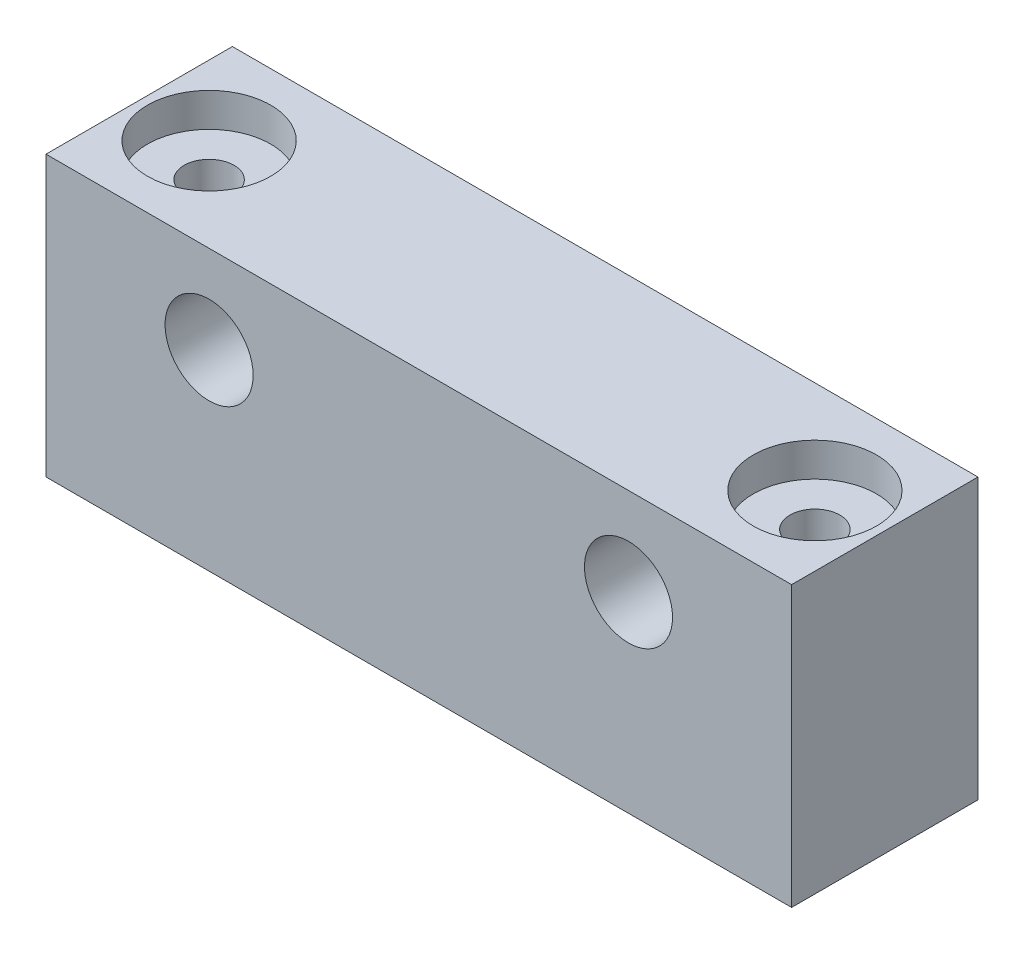
ISO-10303-21;
HEADER;
FILE_DESCRIPTION(('STEP AP214'),'2;1');
FILE_NAME('part.step','',(''),(''),'','','');
FILE_SCHEMA(('AUTOMOTIVE_DESIGN { 1 0 10303 214 1 1 1 1 }'));
ENDSEC;
DATA;
#1=APPLICATION_CONTEXT('core data for automotive mechanical design processes');
#2=APPLICATION_PROTOCOL_DEFINITION('international standard','automotive_design',2000,#1);
#3=PRODUCT_CONTEXT('',#1,'mechanical');
#4=PRODUCT('Part','Part','',(#3));
#5=PRODUCT_RELATED_PRODUCT_CATEGORY('part','',(#4));
#6=PRODUCT_DEFINITION_FORMATION('','',#4);
#7=PRODUCT_DEFINITION_CONTEXT('part definition',#1,'design');
#8=PRODUCT_DEFINITION('design','',#6,#7);
#9=PRODUCT_DEFINITION_SHAPE('','',#8);
#10=(LENGTH_UNIT() NAMED_UNIT(*) SI_UNIT(.MILLI.,.METRE.));
#11=(NAMED_UNIT(*) PLANE_ANGLE_UNIT() SI_UNIT($,.RADIAN.));
#12=(NAMED_UNIT(*) SI_UNIT($,.STERADIAN.) SOLID_ANGLE_UNIT());
#13=UNCERTAINTY_MEASURE_WITH_UNIT(LENGTH_MEASURE(1.E-05),#10,'distance_accuracy_value','');
#14=(GEOMETRIC_REPRESENTATION_CONTEXT(3) GLOBAL_UNCERTAINTY_ASSIGNED_CONTEXT((#13)) GLOBAL_UNIT_ASSIGNED_CONTEXT((#10,
#11,#12)) REPRESENTATION_CONTEXT('',''));
#15=CARTESIAN_POINT('',(0.,0.,0.));
#16=DIRECTION('',(0.,0.,1.));
#17=DIRECTION('',(1.,0.,0.));
#18=AXIS2_PLACEMENT_3D('',#15,#16,#17);
#19=CARTESIAN_POINT('',(0.,0.,12.7));
#20=DIRECTION('',(0.,0.,-1.));
#21=DIRECTION('',(-1.,0.,0.));
#22=AXIS2_PLACEMENT_3D('',#19,#20,#21);
#23=PLANE('',#22);
#24=DIRECTION('',(0.,1.,0.));
#25=VECTOR('',#24,1.);
#26=CARTESIAN_POINT('',(25.4,-9.525,12.7));
#27=LINE('',#26,#25);
#28=CARTESIAN_POINT('',(25.4,-9.525,12.7));
#29=VERTEX_POINT('',#28);
#30=CARTESIAN_POINT('',(25.4,9.525,12.7));
#31=VERTEX_POINT('',#30);
#32=EDGE_CURVE('E86',#29,#31,#27,.T.);
#33=ORIENTED_EDGE('',*,*,#32,.T.);
#34=DIRECTION('',(-1.,0.,0.));
#35=VECTOR('',#34,1.);
#36=CARTESIAN_POINT('',(-25.4,9.525,12.7));
#37=LINE('',#36,#35);
#38=CARTESIAN_POINT('',(-25.4,9.525,12.7));
#39=VERTEX_POINT('',#38);
#40=EDGE_CURVE('E81',#31,#39,#37,.T.);
#41=ORIENTED_EDGE('',*,*,#40,.T.);
#42=DIRECTION('',(0.,-1.,0.));
#43=VECTOR('',#42,1.);
#44=CARTESIAN_POINT('',(-25.4,-9.525,12.7));
#45=LINE('',#44,#43);
#46=CARTESIAN_POINT('',(-25.4,-9.525,12.7));
#47=VERTEX_POINT('',#46);
#48=EDGE_CURVE('E84',#39,#47,#45,.T.);
#49=ORIENTED_EDGE('',*,*,#48,.T.);
#50=DIRECTION('',(1.,0.,0.));
#51=VECTOR('',#50,1.);
#52=CARTESIAN_POINT('',(-25.4,-9.525,12.7));
#53=LINE('',#52,#51);
#54=EDGE_CURVE('E51',#47,#29,#53,.T.);
#55=ORIENTED_EDGE('',*,*,#54,.T.);
#56=EDGE_LOOP('',(#33,#41,#49,#55));
#57=FACE_BOUND('',#56,.T.);
#58=CARTESIAN_POINT('',(-14.2875,3.525,12.7));
#59=DIRECTION('',(0.,0.,1.));
#60=DIRECTION('',(1.,0.,0.));
#61=AXIS2_PLACEMENT_3D('',#58,#59,#60);
#62=CIRCLE('',#61,3.);
#63=CARTESIAN_POINT('',(-11.2875,3.525,12.7));
#64=VERTEX_POINT('',#63);
#65=EDGE_CURVE('E101',#64,#64,#62,.T.);
#66=ORIENTED_EDGE('',*,*,#65,.F.);
#67=EDGE_LOOP('',(#66));
#68=FACE_BOUND('',#67,.T.);
#69=CARTESIAN_POINT('',(14.2875,3.525,12.7));
#70=DIRECTION('',(0.,0.,1.));
#71=DIRECTION('',(1.,0.,0.));
#72=AXIS2_PLACEMENT_3D('',#69,#70,#71);
#73=CIRCLE('',#72,3.);
#74=CARTESIAN_POINT('',(17.2875,3.525,12.7));
#75=VERTEX_POINT('',#74);
#76=EDGE_CURVE('E116',#75,#75,#73,.T.);
#77=ORIENTED_EDGE('',*,*,#76,.F.);
#78=EDGE_LOOP('',(#77));
#79=FACE_BOUND('',#78,.T.);
#80=ADVANCED_FACE('F34',(#57,#68,#79),#23,.F.);
#81=CARTESIAN_POINT('',(0.,0.,0.));
#82=DIRECTION('',(0.,0.,-1.));
#83=DIRECTION('',(-1.,0.,0.));
#84=AXIS2_PLACEMENT_3D('',#81,#82,#83);
#85=PLANE('',#84);
#86=CARTESIAN_POINT('',(-14.2875,3.525,0.));
#87=DIRECTION('',(0.,0.,1.));
#88=DIRECTION('',(1.,0.,0.));
#89=AXIS2_PLACEMENT_3D('',#86,#87,#88);
#90=CIRCLE('',#89,3.);
#91=CARTESIAN_POINT('',(-11.2875,3.525,0.));
#92=VERTEX_POINT('',#91);
#93=EDGE_CURVE('E113',#92,#92,#90,.T.);
#94=ORIENTED_EDGE('',*,*,#93,.T.);
#95=EDGE_LOOP('',(#94));
#96=FACE_BOUND('',#95,.T.);
#97=DIRECTION('',(0.,1.,0.));
#98=VECTOR('',#97,1.);
#99=CARTESIAN_POINT('',(25.4,-9.525,0.));
#100=LINE('',#99,#98);
#101=CARTESIAN_POINT('',(25.4,-9.525,0.));
#102=VERTEX_POINT('',#101);
#103=CARTESIAN_POINT('',(25.4,9.525,0.));
#104=VERTEX_POINT('',#103);
#105=EDGE_CURVE('E98',#102,#104,#100,.T.);
#106=ORIENTED_EDGE('',*,*,#105,.F.);
#107=DIRECTION('',(1.,0.,0.));
#108=VECTOR('',#107,1.);
#109=CARTESIAN_POINT('',(-25.4,-9.525,0.));
#110=LINE('',#109,#108);
#111=CARTESIAN_POINT('',(-25.4,-9.525,0.));
#112=VERTEX_POINT('',#111);
#113=EDGE_CURVE('E74',#112,#102,#110,.T.);
#114=ORIENTED_EDGE('',*,*,#113,.F.);
#115=DIRECTION('',(0.,-1.,0.));
#116=VECTOR('',#115,1.);
#117=CARTESIAN_POINT('',(-25.4,-9.525,0.));
#118=LINE('',#117,#116);
#119=CARTESIAN_POINT('',(-25.4,9.525,0.));
#120=VERTEX_POINT('',#119);
#121=EDGE_CURVE('E68',#120,#112,#118,.T.);
#122=ORIENTED_EDGE('',*,*,#121,.F.);
#123=DIRECTION('',(-1.,0.,0.));
#124=VECTOR('',#123,1.);
#125=CARTESIAN_POINT('',(-25.4,9.525,0.));
#126=LINE('',#125,#124);
#127=EDGE_CURVE('E90',#104,#120,#126,.T.);
#128=ORIENTED_EDGE('',*,*,#127,.F.);
#129=EDGE_LOOP('',(#106,#114,#122,#128));
#130=FACE_BOUND('',#129,.T.);
#131=CARTESIAN_POINT('',(14.2875,3.525,0.));
#132=DIRECTION('',(0.,0.,1.));
#133=DIRECTION('',(1.,0.,0.));
#134=AXIS2_PLACEMENT_3D('',#131,#132,#133);
#135=CIRCLE('',#134,3.);
#136=CARTESIAN_POINT('',(17.2875,3.525,0.));
#137=VERTEX_POINT('',#136);
#138=EDGE_CURVE('E119',#137,#137,#135,.T.);
#139=ORIENTED_EDGE('',*,*,#138,.T.);
#140=EDGE_LOOP('',(#139));
#141=FACE_BOUND('',#140,.T.);
#142=ADVANCED_FACE('F109',(#96,#130,#141),#85,.T.);
#143=CARTESIAN_POINT('',(25.4,-9.525,12.7));
#144=DIRECTION('',(-1.,0.,0.));
#145=DIRECTION('',(0.,0.,1.));
#146=AXIS2_PLACEMENT_3D('',#143,#144,#145);
#147=PLANE('',#146);
#148=ORIENTED_EDGE('',*,*,#105,.T.);
#149=DIRECTION('',(0.,0.,-1.));
#150=VECTOR('',#149,1.);
#151=CARTESIAN_POINT('',(25.4,9.525,12.7));
#152=LINE('',#151,#150);
#153=EDGE_CURVE('E11',#31,#104,#152,.T.);
#154=ORIENTED_EDGE('',*,*,#153,.F.);
#155=ORIENTED_EDGE('',*,*,#32,.F.);
#156=DIRECTION('',(0.,0.,-1.));
#157=VECTOR('',#156,1.);
#158=CARTESIAN_POINT('',(25.4,-9.525,12.7));
#159=LINE('',#158,#157);
#160=EDGE_CURVE('E94',#29,#102,#159,.T.);
#161=ORIENTED_EDGE('',*,*,#160,.T.);
#162=EDGE_LOOP('',(#148,#154,#155,#161));
#163=FACE_BOUND('',#162,.T.);
#164=ADVANCED_FACE('F36',(#163),#147,.F.);
#165=CARTESIAN_POINT('',(-25.4,9.525,12.7));
#166=DIRECTION('',(0.,-1.,0.));
#167=DIRECTION('',(0.,0.,-1.));
#168=AXIS2_PLACEMENT_3D('',#165,#166,#167);
#169=PLANE('',#168);
#170=CARTESIAN_POINT('',(-20.6375,9.525,6.35));
#171=DIRECTION('',(0.,1.,0.));
#172=DIRECTION('',(0.,0.,1.));
#173=AXIS2_PLACEMENT_3D('',#170,#171,#172);
#174=CIRCLE('',#173,4.2);
#175=CARTESIAN_POINT('',(-20.6375,9.525,10.55));
#176=VERTEX_POINT('',#175);
#177=EDGE_CURVE('E145',#176,#176,#174,.T.);
#178=ORIENTED_EDGE('',*,*,#177,.F.);
#179=EDGE_LOOP('',(#178));
#180=FACE_BOUND('',#179,.T.);
#181=CARTESIAN_POINT('',(20.6375,9.525,6.35));
#182=DIRECTION('',(0.,1.,0.));
#183=DIRECTION('',(0.,0.,1.));
#184=AXIS2_PLACEMENT_3D('',#181,#182,#183);
#185=CIRCLE('',#184,4.2);
#186=CARTESIAN_POINT('',(20.6375,9.525,10.55));
#187=VERTEX_POINT('',#186);
#188=EDGE_CURVE('E133',#187,#187,#185,.T.);
#189=ORIENTED_EDGE('',*,*,#188,.F.);
#190=EDGE_LOOP('',(#189));
#191=FACE_BOUND('',#190,.T.);
#192=ORIENTED_EDGE('',*,*,#127,.T.);
#193=DIRECTION('',(0.,0.,-1.));
#194=VECTOR('',#193,1.);
#195=CARTESIAN_POINT('',(-25.4,9.525,12.7));
#196=LINE('',#195,#194);
#197=EDGE_CURVE('E43',#39,#120,#196,.T.);
#198=ORIENTED_EDGE('',*,*,#197,.F.);
#199=ORIENTED_EDGE('',*,*,#40,.F.);
#200=ORIENTED_EDGE('',*,*,#153,.T.);
#201=EDGE_LOOP('',(#192,#198,#199,#200));
#202=FACE_BOUND('',#201,.T.);
#203=ADVANCED_FACE('F89',(#180,#191,#202),#169,.F.);
#204=CARTESIAN_POINT('',(-25.4,-9.525,12.7));
#205=DIRECTION('',(1.,0.,0.));
#206=DIRECTION('',(0.,0.,-1.));
#207=AXIS2_PLACEMENT_3D('',#204,#205,#206);
#208=PLANE('',#207);
#209=ORIENTED_EDGE('',*,*,#121,.T.);
#210=DIRECTION('',(0.,0.,-1.));
#211=VECTOR('',#210,1.);
#212=CARTESIAN_POINT('',(-25.4,-9.525,12.7));
#213=LINE('',#212,#211);
#214=EDGE_CURVE('E91',#47,#112,#213,.T.);
#215=ORIENTED_EDGE('',*,*,#214,.F.);
#216=ORIENTED_EDGE('',*,*,#48,.F.);
#217=ORIENTED_EDGE('',*,*,#197,.T.);
#218=EDGE_LOOP('',(#209,#215,#216,#217));
#219=FACE_BOUND('',#218,.T.);
#220=ADVANCED_FACE('F92',(#219),#208,.F.);
#221=CARTESIAN_POINT('',(-25.4,-9.525,12.7));
#222=DIRECTION('',(0.,1.,0.));
#223=DIRECTION('',(0.,0.,1.));
#224=AXIS2_PLACEMENT_3D('',#221,#222,#223);
#225=PLANE('',#224);
#226=CARTESIAN_POINT('',(-20.6375,-9.525,6.35));
#227=DIRECTION('',(0.,1.,0.));
#228=DIRECTION('',(0.,0.,1.));
#229=AXIS2_PLACEMENT_3D('',#226,#227,#228);
#230=CIRCLE('',#229,1.7);
#231=CARTESIAN_POINT('',(-20.6375,-9.525,8.05));
#232=VERTEX_POINT('',#231);
#233=EDGE_CURVE('E136',#232,#232,#230,.T.);
#234=ORIENTED_EDGE('',*,*,#233,.T.);
#235=EDGE_LOOP('',(#234));
#236=FACE_BOUND('',#235,.T.);
#237=CARTESIAN_POINT('',(20.6375,-9.525,6.35));
#238=DIRECTION('',(0.,1.,0.));
#239=DIRECTION('',(0.,0.,1.));
#240=AXIS2_PLACEMENT_3D('',#237,#238,#239);
#241=CIRCLE('',#240,1.7);
#242=CARTESIAN_POINT('',(20.6375,-9.525,8.05));
#243=VERTEX_POINT('',#242);
#244=EDGE_CURVE('E122',#243,#243,#241,.T.);
#245=ORIENTED_EDGE('',*,*,#244,.T.);
#246=EDGE_LOOP('',(#245));
#247=FACE_BOUND('',#246,.T.);
#248=ORIENTED_EDGE('',*,*,#113,.T.);
#249=ORIENTED_EDGE('',*,*,#160,.F.);
#250=ORIENTED_EDGE('',*,*,#54,.F.);
#251=ORIENTED_EDGE('',*,*,#214,.T.);
#252=EDGE_LOOP('',(#248,#249,#250,#251));
#253=FACE_BOUND('',#252,.T.);
#254=ADVANCED_FACE('F106',(#236,#247,#253),#225,.F.);
#255=CARTESIAN_POINT('',(-14.2875,3.525,12.7));
#256=DIRECTION('',(0.,0.,-1.));
#257=DIRECTION('',(-1.,0.,0.));
#258=AXIS2_PLACEMENT_3D('',#255,#256,#257);
#259=CYLINDRICAL_SURFACE('',#258,3.);
#260=ORIENTED_EDGE('',*,*,#65,.T.);
#261=EDGE_LOOP('',(#260));
#262=FACE_BOUND('',#261,.T.);
#263=ORIENTED_EDGE('',*,*,#93,.F.);
#264=EDGE_LOOP('',(#263));
#265=FACE_BOUND('',#264,.T.);
#266=ADVANCED_FACE('F180',(#262,#265),#259,.F.);
#267=CARTESIAN_POINT('',(14.2875,3.525,12.7));
#268=DIRECTION('',(0.,0.,-1.));
#269=DIRECTION('',(-1.,0.,0.));
#270=AXIS2_PLACEMENT_3D('',#267,#268,#269);
#271=CYLINDRICAL_SURFACE('',#270,3.);
#272=ORIENTED_EDGE('',*,*,#76,.T.);
#273=EDGE_LOOP('',(#272));
#274=FACE_BOUND('',#273,.T.);
#275=ORIENTED_EDGE('',*,*,#138,.F.);
#276=EDGE_LOOP('',(#275));
#277=FACE_BOUND('',#276,.T.);
#278=ADVANCED_FACE('F204',(#274,#277),#271,.F.);
#279=CARTESIAN_POINT('',(20.6375,9.525,6.35));
#280=DIRECTION('',(0.,1.,0.));
#281=DIRECTION('',(0.,0.,1.));
#282=AXIS2_PLACEMENT_3D('',#279,#280,#281);
#283=CYLINDRICAL_SURFACE('',#282,1.7);
#284=ORIENTED_EDGE('',*,*,#244,.F.);
#285=EDGE_LOOP('',(#284));
#286=FACE_BOUND('',#285,.T.);
#287=CARTESIAN_POINT('',(20.6375,7.225,6.35));
#288=DIRECTION('',(0.,1.,0.));
#289=DIRECTION('',(0.,0.,1.));
#290=AXIS2_PLACEMENT_3D('',#287,#288,#289);
#291=CIRCLE('',#290,1.7);
#292=CARTESIAN_POINT('',(20.6375,7.225,8.05));
#293=VERTEX_POINT('',#292);
#294=EDGE_CURVE('E127',#293,#293,#291,.T.);
#295=ORIENTED_EDGE('',*,*,#294,.T.);
#296=EDGE_LOOP('',(#295));
#297=FACE_BOUND('',#296,.T.);
#298=ADVANCED_FACE('F168',(#286,#297),#283,.F.);
#299=CARTESIAN_POINT('',(22.3375,7.225,6.35));
#300=DIRECTION('',(0.,-1.,0.));
#301=DIRECTION('',(0.,0.,-1.));
#302=AXIS2_PLACEMENT_3D('',#299,#300,#301);
#303=PLANE('',#302);
#304=ORIENTED_EDGE('',*,*,#294,.F.);
#305=EDGE_LOOP('',(#304));
#306=FACE_BOUND('',#305,.T.);
#307=CARTESIAN_POINT('',(20.6375,7.225,6.35));
#308=DIRECTION('',(0.,1.,0.));
#309=DIRECTION('',(0.,0.,1.));
#310=AXIS2_PLACEMENT_3D('',#307,#308,#309);
#311=CIRCLE('',#310,4.2);
#312=CARTESIAN_POINT('',(20.6375,7.225,10.55));
#313=VERTEX_POINT('',#312);
#314=EDGE_CURVE('E130',#313,#313,#311,.T.);
#315=ORIENTED_EDGE('',*,*,#314,.T.);
#316=EDGE_LOOP('',(#315));
#317=FACE_BOUND('',#316,.T.);
#318=ADVANCED_FACE('F158',(#306,#317),#303,.F.);
#319=CARTESIAN_POINT('',(20.6375,9.525,6.35));
#320=DIRECTION('',(0.,1.,0.));
#321=DIRECTION('',(0.,0.,1.));
#322=AXIS2_PLACEMENT_3D('',#319,#320,#321);
#323=CYLINDRICAL_SURFACE('',#322,4.2);
#324=ORIENTED_EDGE('',*,*,#314,.F.);
#325=EDGE_LOOP('',(#324));
#326=FACE_BOUND('',#325,.T.);
#327=ORIENTED_EDGE('',*,*,#188,.T.);
#328=EDGE_LOOP('',(#327));
#329=FACE_BOUND('',#328,.T.);
#330=ADVANCED_FACE('F155',(#326,#329),#323,.F.);
#331=CARTESIAN_POINT('',(-20.6375,9.525,6.35));
#332=DIRECTION('',(0.,1.,0.));
#333=DIRECTION('',(0.,0.,1.));
#334=AXIS2_PLACEMENT_3D('',#331,#332,#333);
#335=CYLINDRICAL_SURFACE('',#334,1.7);
#336=ORIENTED_EDGE('',*,*,#233,.F.);
#337=EDGE_LOOP('',(#336));
#338=FACE_BOUND('',#337,.T.);
#339=CARTESIAN_POINT('',(-20.6375,7.225,6.35));
#340=DIRECTION('',(0.,1.,0.));
#341=DIRECTION('',(0.,0.,1.));
#342=AXIS2_PLACEMENT_3D('',#339,#340,#341);
#343=CIRCLE('',#342,1.7);
#344=CARTESIAN_POINT('',(-20.6375,7.225,8.05));
#345=VERTEX_POINT('',#344);
#346=EDGE_CURVE('E139',#345,#345,#343,.T.);
#347=ORIENTED_EDGE('',*,*,#346,.T.);
#348=EDGE_LOOP('',(#347));
#349=FACE_BOUND('',#348,.T.);
#350=ADVANCED_FACE('F157',(#338,#349),#335,.F.);
#351=CARTESIAN_POINT('',(-18.9375,7.225,6.35));
#352=DIRECTION('',(0.,-1.,0.));
#353=DIRECTION('',(0.,0.,-1.));
#354=AXIS2_PLACEMENT_3D('',#351,#352,#353);
#355=PLANE('',#354);
#356=ORIENTED_EDGE('',*,*,#346,.F.);
#357=EDGE_LOOP('',(#356));
#358=FACE_BOUND('',#357,.T.);
#359=CARTESIAN_POINT('',(-20.6375,7.225,6.35));
#360=DIRECTION('',(0.,1.,0.));
#361=DIRECTION('',(0.,0.,1.));
#362=AXIS2_PLACEMENT_3D('',#359,#360,#361);
#363=CIRCLE('',#362,4.2);
#364=CARTESIAN_POINT('',(-20.6375,7.225,10.55));
#365=VERTEX_POINT('',#364);
#366=EDGE_CURVE('E142',#365,#365,#363,.T.);
#367=ORIENTED_EDGE('',*,*,#366,.T.);
#368=EDGE_LOOP('',(#367));
#369=FACE_BOUND('',#368,.T.);
#370=ADVANCED_FACE('F165',(#358,#369),#355,.F.);
#371=CARTESIAN_POINT('',(-20.6375,9.525,6.35));
#372=DIRECTION('',(0.,1.,0.));
#373=DIRECTION('',(0.,0.,1.));
#374=AXIS2_PLACEMENT_3D('',#371,#372,#373);
#375=CYLINDRICAL_SURFACE('',#374,4.2);
#376=ORIENTED_EDGE('',*,*,#366,.F.);
#377=EDGE_LOOP('',(#376));
#378=FACE_BOUND('',#377,.T.);
#379=ORIENTED_EDGE('',*,*,#177,.T.);
#380=EDGE_LOOP('',(#379));
#381=FACE_BOUND('',#380,.T.);
#382=ADVANCED_FACE('F149',(#378,#381),#375,.F.);
#383=CLOSED_SHELL('',(#80,#142,#164,#203,#220,#254,#266,#278,#298,#318,#330,#350,#370,#382));
#384=MANIFOLD_SOLID_BREP('B2',#383);
#385=ADVANCED_BREP_SHAPE_REPRESENTATION('',(#18,#384),#14);
#386=SHAPE_DEFINITION_REPRESENTATION(#9,#385);
ENDSEC;
END-ISO-10303-21;
